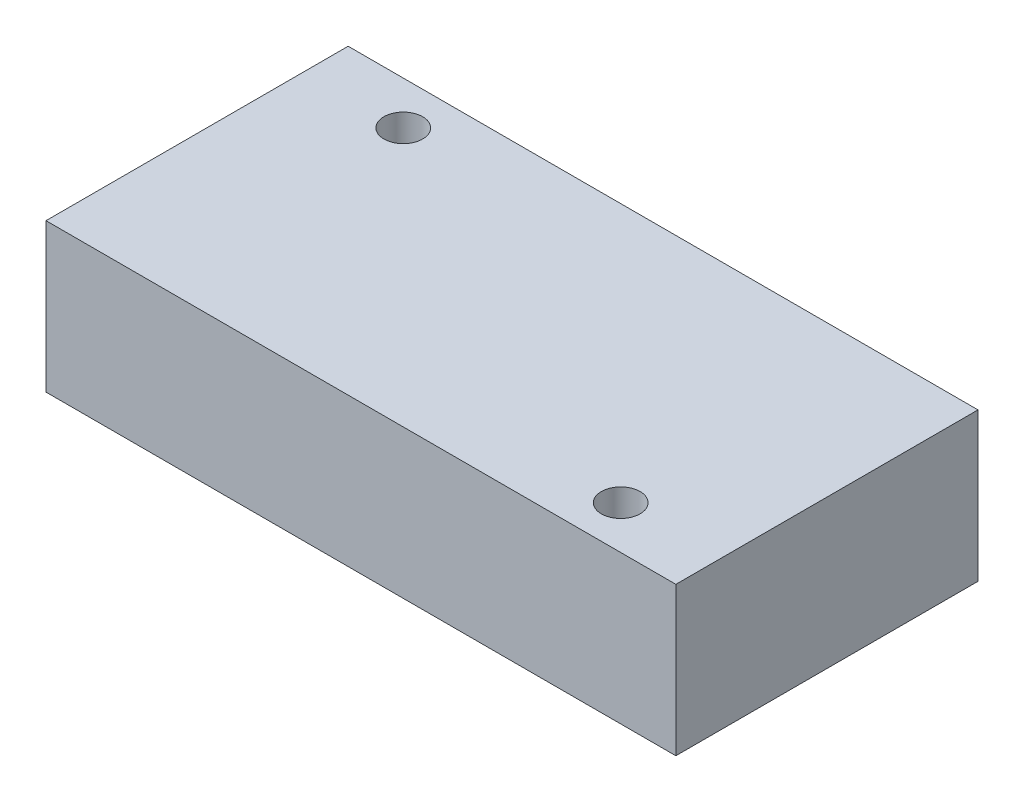
ISO-10303-21;
HEADER;
FILE_DESCRIPTION(('STEP AP214'),'2;1');
FILE_NAME('part.step','',(''),(''),'','','');
FILE_SCHEMA(('AUTOMOTIVE_DESIGN { 1 0 10303 214 1 1 1 1 }'));
ENDSEC;
DATA;
#1=APPLICATION_CONTEXT('core data for automotive mechanical design processes');
#2=APPLICATION_PROTOCOL_DEFINITION('international standard','automotive_design',2000,#1);
#3=PRODUCT_CONTEXT('',#1,'mechanical');
#4=PRODUCT('Part','Part','',(#3));
#5=PRODUCT_RELATED_PRODUCT_CATEGORY('part','',(#4));
#6=PRODUCT_DEFINITION_FORMATION('','',#4);
#7=PRODUCT_DEFINITION_CONTEXT('part definition',#1,'design');
#8=PRODUCT_DEFINITION('design','',#6,#7);
#9=PRODUCT_DEFINITION_SHAPE('','',#8);
#10=(LENGTH_UNIT() NAMED_UNIT(*) SI_UNIT(.MILLI.,.METRE.));
#11=(NAMED_UNIT(*) PLANE_ANGLE_UNIT() SI_UNIT($,.RADIAN.));
#12=(NAMED_UNIT(*) SI_UNIT($,.STERADIAN.) SOLID_ANGLE_UNIT());
#13=UNCERTAINTY_MEASURE_WITH_UNIT(LENGTH_MEASURE(1.E-05),#10,'distance_accuracy_value','');
#14=(GEOMETRIC_REPRESENTATION_CONTEXT(3) GLOBAL_UNCERTAINTY_ASSIGNED_CONTEXT((#13)) GLOBAL_UNIT_ASSIGNED_CONTEXT((#10,
#11,#12)) REPRESENTATION_CONTEXT('',''));
#15=CARTESIAN_POINT('',(0.,0.,0.));
#16=DIRECTION('',(0.,0.,1.));
#17=DIRECTION('',(1.,0.,0.));
#18=AXIS2_PLACEMENT_3D('',#15,#16,#17);
#19=CARTESIAN_POINT('',(-24.39,11.5,11.7));
#20=DIRECTION('',(1.,0.,0.));
#21=DIRECTION('',(0.,0.,-1.));
#22=AXIS2_PLACEMENT_3D('',#19,#20,#21);
#23=PLANE('',#22);
#24=DIRECTION('',(0.,0.,1.));
#25=VECTOR('',#24,1.);
#26=CARTESIAN_POINT('',(-24.39,0.,11.7));
#27=LINE('',#26,#25);
#28=CARTESIAN_POINT('',(-24.39,0.,-11.7));
#29=VERTEX_POINT('',#28);
#30=CARTESIAN_POINT('',(-24.39,0.,11.7));
#31=VERTEX_POINT('',#30);
#32=EDGE_CURVE('E95',#29,#31,#27,.T.);
#33=ORIENTED_EDGE('',*,*,#32,.T.);
#34=DIRECTION('',(0.,-1.,0.));
#35=VECTOR('',#34,1.);
#36=CARTESIAN_POINT('',(-24.39,11.5,11.7));
#37=LINE('',#36,#35);
#38=CARTESIAN_POINT('',(-24.39,11.5,11.7));
#39=VERTEX_POINT('',#38);
#40=EDGE_CURVE('E11',#39,#31,#37,.T.);
#41=ORIENTED_EDGE('',*,*,#40,.F.);
#42=DIRECTION('',(0.,0.,1.));
#43=VECTOR('',#42,1.);
#44=CARTESIAN_POINT('',(-24.39,11.5,11.7));
#45=LINE('',#44,#43);
#46=CARTESIAN_POINT('',(-24.39,11.5,-11.7));
#47=VERTEX_POINT('',#46);
#48=EDGE_CURVE('E83',#47,#39,#45,.T.);
#49=ORIENTED_EDGE('',*,*,#48,.F.);
#50=DIRECTION('',(0.,-1.,0.));
#51=VECTOR('',#50,1.);
#52=CARTESIAN_POINT('',(-24.39,11.5,-11.7));
#53=LINE('',#52,#51);
#54=EDGE_CURVE('E91',#47,#29,#53,.T.);
#55=ORIENTED_EDGE('',*,*,#54,.T.);
#56=EDGE_LOOP('',(#33,#41,#49,#55));
#57=FACE_BOUND('',#56,.T.);
#58=ADVANCED_FACE('F32',(#57),#23,.F.);
#59=CARTESIAN_POINT('',(24.39,11.5,11.7));
#60=DIRECTION('',(0.,0.,-1.));
#61=DIRECTION('',(-1.,0.,0.));
#62=AXIS2_PLACEMENT_3D('',#59,#60,#61);
#63=PLANE('',#62);
#64=DIRECTION('',(1.,0.,0.));
#65=VECTOR('',#64,1.);
#66=CARTESIAN_POINT('',(24.39,0.,11.7));
#67=LINE('',#66,#65);
#68=CARTESIAN_POINT('',(24.39,0.,11.7));
#69=VERTEX_POINT('',#68);
#70=EDGE_CURVE('E87',#31,#69,#67,.T.);
#71=ORIENTED_EDGE('',*,*,#70,.T.);
#72=DIRECTION('',(0.,-1.,0.));
#73=VECTOR('',#72,1.);
#74=CARTESIAN_POINT('',(24.39,11.5,11.7));
#75=LINE('',#74,#73);
#76=CARTESIAN_POINT('',(24.39,11.5,11.7));
#77=VERTEX_POINT('',#76);
#78=EDGE_CURVE('E40',#77,#69,#75,.T.);
#79=ORIENTED_EDGE('',*,*,#78,.F.);
#80=DIRECTION('',(1.,0.,0.));
#81=VECTOR('',#80,1.);
#82=CARTESIAN_POINT('',(24.39,11.5,11.7));
#83=LINE('',#82,#81);
#84=EDGE_CURVE('E78',#39,#77,#83,.T.);
#85=ORIENTED_EDGE('',*,*,#84,.F.);
#86=ORIENTED_EDGE('',*,*,#40,.T.);
#87=EDGE_LOOP('',(#71,#79,#85,#86));
#88=FACE_BOUND('',#87,.T.);
#89=ADVANCED_FACE('F86',(#88),#63,.F.);
#90=CARTESIAN_POINT('',(24.39,11.5,11.7));
#91=DIRECTION('',(-1.,0.,0.));
#92=DIRECTION('',(0.,0.,1.));
#93=AXIS2_PLACEMENT_3D('',#90,#91,#92);
#94=PLANE('',#93);
#95=DIRECTION('',(0.,0.,-1.));
#96=VECTOR('',#95,1.);
#97=CARTESIAN_POINT('',(24.39,0.,11.7));
#98=LINE('',#97,#96);
#99=CARTESIAN_POINT('',(24.39,0.,-11.7));
#100=VERTEX_POINT('',#99);
#101=EDGE_CURVE('E65',#69,#100,#98,.T.);
#102=ORIENTED_EDGE('',*,*,#101,.T.);
#103=DIRECTION('',(0.,-1.,0.));
#104=VECTOR('',#103,1.);
#105=CARTESIAN_POINT('',(24.39,11.5,-11.7));
#106=LINE('',#105,#104);
#107=CARTESIAN_POINT('',(24.39,11.5,-11.7));
#108=VERTEX_POINT('',#107);
#109=EDGE_CURVE('E88',#108,#100,#106,.T.);
#110=ORIENTED_EDGE('',*,*,#109,.F.);
#111=DIRECTION('',(0.,0.,-1.));
#112=VECTOR('',#111,1.);
#113=CARTESIAN_POINT('',(24.39,11.5,11.7));
#114=LINE('',#113,#112);
#115=EDGE_CURVE('E81',#77,#108,#114,.T.);
#116=ORIENTED_EDGE('',*,*,#115,.F.);
#117=ORIENTED_EDGE('',*,*,#78,.T.);
#118=EDGE_LOOP('',(#102,#110,#116,#117));
#119=FACE_BOUND('',#118,.T.);
#120=ADVANCED_FACE('F89',(#119),#94,.F.);
#121=CARTESIAN_POINT('',(24.39,11.5,-11.7));
#122=DIRECTION('',(0.,0.,1.));
#123=DIRECTION('',(1.,0.,0.));
#124=AXIS2_PLACEMENT_3D('',#121,#122,#123);
#125=PLANE('',#124);
#126=DIRECTION('',(-1.,0.,0.));
#127=VECTOR('',#126,1.);
#128=CARTESIAN_POINT('',(24.39,0.,-11.7));
#129=LINE('',#128,#127);
#130=EDGE_CURVE('E71',#100,#29,#129,.T.);
#131=ORIENTED_EDGE('',*,*,#130,.T.);
#132=ORIENTED_EDGE('',*,*,#54,.F.);
#133=DIRECTION('',(-1.,0.,0.));
#134=VECTOR('',#133,1.);
#135=CARTESIAN_POINT('',(24.39,11.5,-11.7));
#136=LINE('',#135,#134);
#137=EDGE_CURVE('E48',#108,#47,#136,.T.);
#138=ORIENTED_EDGE('',*,*,#137,.F.);
#139=ORIENTED_EDGE('',*,*,#109,.T.);
#140=EDGE_LOOP('',(#131,#132,#138,#139));
#141=FACE_BOUND('',#140,.T.);
#142=ADVANCED_FACE('F103',(#141),#125,.F.);
#143=CARTESIAN_POINT('',(0.,11.5,0.));
#144=DIRECTION('',(0.,1.,0.));
#145=DIRECTION('',(0.,0.,1.));
#146=AXIS2_PLACEMENT_3D('',#143,#144,#145);
#147=PLANE('',#146);
#148=CARTESIAN_POINT('',(-16.78,11.5,-8.36));
#149=DIRECTION('',(0.,1.,0.));
#150=DIRECTION('',(0.,0.,1.));
#151=AXIS2_PLACEMENT_3D('',#148,#149,#150);
#152=CIRCLE('',#151,1.5);
#153=CARTESIAN_POINT('',(-16.78,11.5,-6.86));
#154=VERTEX_POINT('',#153);
#155=EDGE_CURVE('E112',#154,#154,#152,.T.);
#156=ORIENTED_EDGE('',*,*,#155,.F.);
#157=EDGE_LOOP('',(#156));
#158=FACE_BOUND('',#157,.T.);
#159=CARTESIAN_POINT('',(16.78,11.5,8.36));
#160=DIRECTION('',(0.,1.,0.));
#161=DIRECTION('',(0.,0.,1.));
#162=AXIS2_PLACEMENT_3D('',#159,#160,#161);
#163=CIRCLE('',#162,1.5);
#164=CARTESIAN_POINT('',(16.78,11.5,9.86));
#165=VERTEX_POINT('',#164);
#166=EDGE_CURVE('E113',#165,#165,#163,.T.);
#167=ORIENTED_EDGE('',*,*,#166,.F.);
#168=EDGE_LOOP('',(#167));
#169=FACE_BOUND('',#168,.T.);
#170=ORIENTED_EDGE('',*,*,#48,.T.);
#171=ORIENTED_EDGE('',*,*,#84,.T.);
#172=ORIENTED_EDGE('',*,*,#115,.T.);
#173=ORIENTED_EDGE('',*,*,#137,.T.);
#174=EDGE_LOOP('',(#170,#171,#172,#173));
#175=FACE_BOUND('',#174,.T.);
#176=ADVANCED_FACE('F79',(#158,#169,#175),#147,.T.);
#177=CARTESIAN_POINT('',(0.,0.,0.));
#178=DIRECTION('',(0.,1.,0.));
#179=DIRECTION('',(0.,0.,1.));
#180=AXIS2_PLACEMENT_3D('',#177,#178,#179);
#181=PLANE('',#180);
#182=CARTESIAN_POINT('',(-16.78,0.,-8.36));
#183=DIRECTION('',(0.,1.,0.));
#184=DIRECTION('',(0.,0.,1.));
#185=AXIS2_PLACEMENT_3D('',#182,#183,#184);
#186=CIRCLE('',#185,1.5);
#187=CARTESIAN_POINT('',(-16.78,0.,-6.86));
#188=VERTEX_POINT('',#187);
#189=EDGE_CURVE('E98',#188,#188,#186,.F.);
#190=ORIENTED_EDGE('',*,*,#189,.F.);
#191=EDGE_LOOP('',(#190));
#192=FACE_BOUND('',#191,.T.);
#193=CARTESIAN_POINT('',(16.78,0.,8.36));
#194=DIRECTION('',(0.,1.,0.));
#195=DIRECTION('',(0.,0.,1.));
#196=AXIS2_PLACEMENT_3D('',#193,#194,#195);
#197=CIRCLE('',#196,1.5);
#198=CARTESIAN_POINT('',(16.78,0.,9.86));
#199=VERTEX_POINT('',#198);
#200=EDGE_CURVE('E109',#199,#199,#197,.F.);
#201=ORIENTED_EDGE('',*,*,#200,.F.);
#202=EDGE_LOOP('',(#201));
#203=FACE_BOUND('',#202,.T.);
#204=ORIENTED_EDGE('',*,*,#32,.F.);
#205=ORIENTED_EDGE('',*,*,#130,.F.);
#206=ORIENTED_EDGE('',*,*,#101,.F.);
#207=ORIENTED_EDGE('',*,*,#70,.F.);
#208=EDGE_LOOP('',(#204,#205,#206,#207));
#209=FACE_BOUND('',#208,.T.);
#210=ADVANCED_FACE('F106',(#192,#203,#209),#181,.F.);
#211=CARTESIAN_POINT('',(16.78,-0.000999999999999265,8.36));
#212=DIRECTION('',(0.,1.,0.));
#213=DIRECTION('',(0.,0.,1.));
#214=AXIS2_PLACEMENT_3D('',#211,#212,#213);
#215=CYLINDRICAL_SURFACE('',#214,1.5);
#216=ORIENTED_EDGE('',*,*,#166,.T.);
#217=EDGE_LOOP('',(#216));
#218=FACE_BOUND('',#217,.T.);
#219=ORIENTED_EDGE('',*,*,#200,.T.);
#220=EDGE_LOOP('',(#219));
#221=FACE_BOUND('',#220,.T.);
#222=ADVANCED_FACE('F129',(#218,#221),#215,.F.);
#223=CARTESIAN_POINT('',(-16.78,-0.000999999999999265,-8.36));
#224=DIRECTION('',(0.,1.,0.));
#225=DIRECTION('',(0.,0.,1.));
#226=AXIS2_PLACEMENT_3D('',#223,#224,#225);
#227=CYLINDRICAL_SURFACE('',#226,1.5);
#228=ORIENTED_EDGE('',*,*,#155,.T.);
#229=EDGE_LOOP('',(#228));
#230=FACE_BOUND('',#229,.T.);
#231=ORIENTED_EDGE('',*,*,#189,.T.);
#232=EDGE_LOOP('',(#231));
#233=FACE_BOUND('',#232,.T.);
#234=ADVANCED_FACE('F121',(#230,#233),#227,.F.);
#235=CLOSED_SHELL('',(#58,#89,#120,#142,#176,#210,#222,#234));
#236=MANIFOLD_SOLID_BREP('B2',#235);
#237=ADVANCED_BREP_SHAPE_REPRESENTATION('',(#18,#236),#14);
#238=SHAPE_DEFINITION_REPRESENTATION(#9,#237);
ENDSEC;
END-ISO-10303-21;
